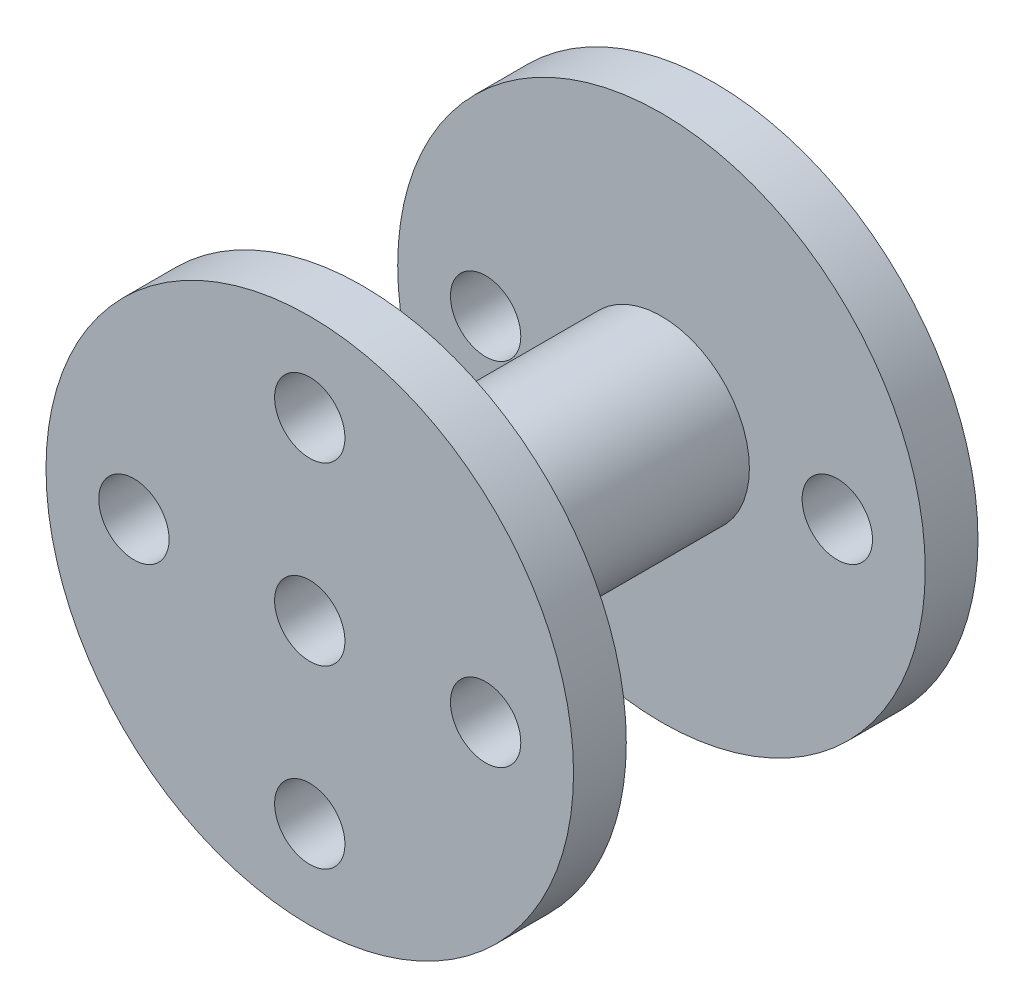
ISO-10303-21;
HEADER;
FILE_DESCRIPTION(('STEP AP214'),'2;1');
FILE_NAME('part.step','',(''),(''),'','','');
FILE_SCHEMA(('AUTOMOTIVE_DESIGN { 1 0 10303 214 1 1 1 1 }'));
ENDSEC;
DATA;
#1=APPLICATION_CONTEXT('core data for automotive mechanical design processes');
#2=APPLICATION_PROTOCOL_DEFINITION('international standard','automotive_design',2000,#1);
#3=PRODUCT_CONTEXT('',#1,'mechanical');
#4=PRODUCT('Part','Part','',(#3));
#5=PRODUCT_RELATED_PRODUCT_CATEGORY('part','',(#4));
#6=PRODUCT_DEFINITION_FORMATION('','',#4);
#7=PRODUCT_DEFINITION_CONTEXT('part definition',#1,'design');
#8=PRODUCT_DEFINITION('design','',#6,#7);
#9=PRODUCT_DEFINITION_SHAPE('','',#8);
#10=(LENGTH_UNIT() NAMED_UNIT(*) SI_UNIT(.MILLI.,.METRE.));
#11=(NAMED_UNIT(*) PLANE_ANGLE_UNIT() SI_UNIT($,.RADIAN.));
#12=(NAMED_UNIT(*) SI_UNIT($,.STERADIAN.) SOLID_ANGLE_UNIT());
#13=UNCERTAINTY_MEASURE_WITH_UNIT(LENGTH_MEASURE(1.E-05),#10,'distance_accuracy_value','');
#14=(GEOMETRIC_REPRESENTATION_CONTEXT(3) GLOBAL_UNCERTAINTY_ASSIGNED_CONTEXT((#13)) GLOBAL_UNIT_ASSIGNED_CONTEXT((#10,
#11,#12)) REPRESENTATION_CONTEXT('',''));
#15=CARTESIAN_POINT('',(0.,0.,0.));
#16=DIRECTION('',(0.,0.,1.));
#17=DIRECTION('',(1.,0.,0.));
#18=AXIS2_PLACEMENT_3D('',#15,#16,#17);
#19=CARTESIAN_POINT('',(0.,0.,3.));
#20=DIRECTION('',(0.,0.,1.));
#21=DIRECTION('',(1.,0.,0.));
#22=AXIS2_PLACEMENT_3D('',#19,#20,#21);
#23=PLANE('',#22);
#24=CARTESIAN_POINT('',(0.,0.,3.));
#25=DIRECTION('',(0.,0.,1.));
#26=DIRECTION('',(1.,0.,0.));
#27=AXIS2_PLACEMENT_3D('',#24,#25,#26);
#28=CIRCLE('',#27,5.);
#29=CARTESIAN_POINT('',(5.,0.,3.));
#30=VERTEX_POINT('',#29);
#31=EDGE_CURVE('E56',#30,#30,#28,.T.);
#32=ORIENTED_EDGE('',*,*,#31,.F.);
#33=EDGE_LOOP('',(#32));
#34=FACE_BOUND('',#33,.T.);
#35=CARTESIAN_POINT('',(10.,0.,3.));
#36=DIRECTION('',(0.,0.,1.));
#37=DIRECTION('',(1.,0.,0.));
#38=AXIS2_PLACEMENT_3D('',#35,#36,#37);
#39=CIRCLE('',#38,2.);
#40=CARTESIAN_POINT('',(12.,0.,3.));
#41=VERTEX_POINT('',#40);
#42=EDGE_CURVE('E42',#41,#41,#39,.T.);
#43=ORIENTED_EDGE('',*,*,#42,.F.);
#44=EDGE_LOOP('',(#43));
#45=FACE_BOUND('',#44,.T.);
#46=CARTESIAN_POINT('',(0.,0.,3.));
#47=DIRECTION('',(0.,0.,1.));
#48=DIRECTION('',(1.,0.,0.));
#49=AXIS2_PLACEMENT_3D('',#46,#47,#48);
#50=CIRCLE('',#49,15.);
#51=CARTESIAN_POINT('',(15.,0.,3.));
#52=VERTEX_POINT('',#51);
#53=EDGE_CURVE('E10',#52,#52,#50,.T.);
#54=ORIENTED_EDGE('',*,*,#53,.T.);
#55=EDGE_LOOP('',(#54));
#56=FACE_BOUND('',#55,.T.);
#57=CARTESIAN_POINT('',(-10.,0.,3.));
#58=DIRECTION('',(0.,0.,1.));
#59=DIRECTION('',(1.,0.,0.));
#60=AXIS2_PLACEMENT_3D('',#57,#58,#59);
#61=CIRCLE('',#60,2.);
#62=CARTESIAN_POINT('',(-8.,0.,3.));
#63=VERTEX_POINT('',#62);
#64=EDGE_CURVE('E47',#63,#63,#61,.T.);
#65=ORIENTED_EDGE('',*,*,#64,.F.);
#66=EDGE_LOOP('',(#65));
#67=FACE_BOUND('',#66,.T.);
#68=ADVANCED_FACE('F31',(#34,#45,#56,#67),#23,.T.);
#69=CARTESIAN_POINT('',(0.,0.,0.));
#70=DIRECTION('',(0.,0.,1.));
#71=DIRECTION('',(1.,0.,0.));
#72=AXIS2_PLACEMENT_3D('',#69,#70,#71);
#73=PLANE('',#72);
#74=CARTESIAN_POINT('',(0.,0.,0.));
#75=DIRECTION('',(0.,0.,1.));
#76=DIRECTION('',(1.,0.,0.));
#77=AXIS2_PLACEMENT_3D('',#74,#75,#76);
#78=CIRCLE('',#77,15.);
#79=CARTESIAN_POINT('',(15.,0.,0.));
#80=VERTEX_POINT('',#79);
#81=EDGE_CURVE('E35',#80,#80,#78,.T.);
#82=ORIENTED_EDGE('',*,*,#81,.F.);
#83=EDGE_LOOP('',(#82));
#84=FACE_BOUND('',#83,.T.);
#85=CARTESIAN_POINT('',(10.,0.,0.));
#86=DIRECTION('',(0.,0.,1.));
#87=DIRECTION('',(1.,0.,0.));
#88=AXIS2_PLACEMENT_3D('',#85,#86,#87);
#89=CIRCLE('',#88,2.);
#90=CARTESIAN_POINT('',(12.,0.,0.));
#91=VERTEX_POINT('',#90);
#92=EDGE_CURVE('E44',#91,#91,#89,.T.);
#93=ORIENTED_EDGE('',*,*,#92,.T.);
#94=EDGE_LOOP('',(#93));
#95=FACE_BOUND('',#94,.T.);
#96=CARTESIAN_POINT('',(-10.,0.,0.));
#97=DIRECTION('',(0.,0.,1.));
#98=DIRECTION('',(1.,0.,0.));
#99=AXIS2_PLACEMENT_3D('',#96,#97,#98);
#100=CIRCLE('',#99,2.);
#101=CARTESIAN_POINT('',(-8.,0.,0.));
#102=VERTEX_POINT('',#101);
#103=EDGE_CURVE('E50',#102,#102,#100,.T.);
#104=ORIENTED_EDGE('',*,*,#103,.T.);
#105=EDGE_LOOP('',(#104));
#106=FACE_BOUND('',#105,.T.);
#107=ADVANCED_FACE('F141',(#84,#95,#106),#73,.F.);
#108=CARTESIAN_POINT('',(0.,0.,3.));
#109=DIRECTION('',(0.,0.,-1.));
#110=DIRECTION('',(-1.,0.,0.));
#111=AXIS2_PLACEMENT_3D('',#108,#109,#110);
#112=CYLINDRICAL_SURFACE('',#111,15.);
#113=ORIENTED_EDGE('',*,*,#53,.F.);
#114=EDGE_LOOP('',(#113));
#115=FACE_BOUND('',#114,.T.);
#116=ORIENTED_EDGE('',*,*,#81,.T.);
#117=EDGE_LOOP('',(#116));
#118=FACE_BOUND('',#117,.T.);
#119=ADVANCED_FACE('F33',(#115,#118),#112,.T.);
#120=CARTESIAN_POINT('',(10.,0.,3.));
#121=DIRECTION('',(0.,0.,-1.));
#122=DIRECTION('',(-1.,0.,0.));
#123=AXIS2_PLACEMENT_3D('',#120,#121,#122);
#124=CYLINDRICAL_SURFACE('',#123,2.);
#125=ORIENTED_EDGE('',*,*,#42,.T.);
#126=EDGE_LOOP('',(#125));
#127=FACE_BOUND('',#126,.T.);
#128=ORIENTED_EDGE('',*,*,#92,.F.);
#129=EDGE_LOOP('',(#128));
#130=FACE_BOUND('',#129,.T.);
#131=ADVANCED_FACE('F151',(#127,#130),#124,.F.);
#132=CARTESIAN_POINT('',(-10.,0.,3.));
#133=DIRECTION('',(0.,0.,-1.));
#134=DIRECTION('',(-1.,0.,0.));
#135=AXIS2_PLACEMENT_3D('',#132,#133,#134);
#136=CYLINDRICAL_SURFACE('',#135,2.);
#137=ORIENTED_EDGE('',*,*,#64,.T.);
#138=EDGE_LOOP('',(#137));
#139=FACE_BOUND('',#138,.T.);
#140=ORIENTED_EDGE('',*,*,#103,.F.);
#141=EDGE_LOOP('',(#140));
#142=FACE_BOUND('',#141,.T.);
#143=ADVANCED_FACE('F154',(#139,#142),#136,.F.);
#144=CARTESIAN_POINT('',(0.,0.,20.));
#145=DIRECTION('',(0.,0.,-1.));
#146=DIRECTION('',(-1.,0.,0.));
#147=AXIS2_PLACEMENT_3D('',#144,#145,#146);
#148=CYLINDRICAL_SURFACE('',#147,5.);
#149=CARTESIAN_POINT('',(0.,0.,20.));
#150=DIRECTION('',(0.,0.,1.));
#151=DIRECTION('',(1.,0.,0.));
#152=AXIS2_PLACEMENT_3D('',#149,#150,#151);
#153=CIRCLE('',#152,5.);
#154=CARTESIAN_POINT('',(5.,0.,20.));
#155=VERTEX_POINT('',#154);
#156=EDGE_CURVE('E53',#155,#155,#153,.T.);
#157=ORIENTED_EDGE('',*,*,#156,.F.);
#158=EDGE_LOOP('',(#157));
#159=FACE_BOUND('',#158,.T.);
#160=ORIENTED_EDGE('',*,*,#31,.T.);
#161=EDGE_LOOP('',(#160));
#162=FACE_BOUND('',#161,.T.);
#163=ADVANCED_FACE('F111',(#159,#162),#148,.T.);
#164=CARTESIAN_POINT('',(0.,0.,23.));
#165=DIRECTION('',(0.,0.,1.));
#166=DIRECTION('',(1.,0.,0.));
#167=AXIS2_PLACEMENT_3D('',#164,#165,#166);
#168=PLANE('',#167);
#169=CARTESIAN_POINT('',(0.,0.,23.));
#170=DIRECTION('',(0.,0.,1.));
#171=DIRECTION('',(1.,0.,0.));
#172=AXIS2_PLACEMENT_3D('',#169,#170,#171);
#173=CIRCLE('',#172,2.);
#174=CARTESIAN_POINT('',(2.,0.,23.));
#175=VERTEX_POINT('',#174);
#176=EDGE_CURVE('E92',#175,#175,#173,.T.);
#177=ORIENTED_EDGE('',*,*,#176,.F.);
#178=EDGE_LOOP('',(#177));
#179=FACE_BOUND('',#178,.T.);
#180=CARTESIAN_POINT('',(10.,0.,23.));
#181=DIRECTION('',(0.,0.,1.));
#182=DIRECTION('',(1.,0.,0.));
#183=AXIS2_PLACEMENT_3D('',#180,#181,#182);
#184=CIRCLE('',#183,2.);
#185=CARTESIAN_POINT('',(12.,0.,23.));
#186=VERTEX_POINT('',#185);
#187=EDGE_CURVE('E77',#186,#186,#184,.T.);
#188=ORIENTED_EDGE('',*,*,#187,.F.);
#189=EDGE_LOOP('',(#188));
#190=FACE_BOUND('',#189,.T.);
#191=CARTESIAN_POINT('',(-10.,0.,23.));
#192=DIRECTION('',(0.,0.,1.));
#193=DIRECTION('',(1.,0.,0.));
#194=AXIS2_PLACEMENT_3D('',#191,#192,#193);
#195=CIRCLE('',#194,2.);
#196=CARTESIAN_POINT('',(-8.,0.,23.));
#197=VERTEX_POINT('',#196);
#198=EDGE_CURVE('E65',#197,#197,#195,.T.);
#199=ORIENTED_EDGE('',*,*,#198,.F.);
#200=EDGE_LOOP('',(#199));
#201=FACE_BOUND('',#200,.T.);
#202=CARTESIAN_POINT('',(0.,0.,23.));
#203=DIRECTION('',(0.,0.,1.));
#204=DIRECTION('',(1.,0.,0.));
#205=AXIS2_PLACEMENT_3D('',#202,#203,#204);
#206=CIRCLE('',#205,15.);
#207=CARTESIAN_POINT('',(15.,0.,23.));
#208=VERTEX_POINT('',#207);
#209=EDGE_CURVE('E59',#208,#208,#206,.T.);
#210=ORIENTED_EDGE('',*,*,#209,.T.);
#211=EDGE_LOOP('',(#210));
#212=FACE_BOUND('',#211,.T.);
#213=CARTESIAN_POINT('',(0.,10.,23.));
#214=DIRECTION('',(0.,0.,1.));
#215=DIRECTION('',(1.,0.,0.));
#216=AXIS2_PLACEMENT_3D('',#213,#214,#215);
#217=CIRCLE('',#216,2.);
#218=CARTESIAN_POINT('',(2.00000000000003,10.,23.));
#219=VERTEX_POINT('',#218);
#220=EDGE_CURVE('E71',#219,#219,#217,.T.);
#221=ORIENTED_EDGE('',*,*,#220,.F.);
#222=EDGE_LOOP('',(#221));
#223=FACE_BOUND('',#222,.T.);
#224=CARTESIAN_POINT('',(-1.05254516842123E-13,-10.,23.));
#225=DIRECTION('',(0.,0.,1.));
#226=DIRECTION('',(1.,0.,0.));
#227=AXIS2_PLACEMENT_3D('',#224,#225,#226);
#228=CIRCLE('',#227,2.);
#229=CARTESIAN_POINT('',(1.9999999999999,-10.,23.));
#230=VERTEX_POINT('',#229);
#231=EDGE_CURVE('E83',#230,#230,#228,.T.);
#232=ORIENTED_EDGE('',*,*,#231,.F.);
#233=EDGE_LOOP('',(#232));
#234=FACE_BOUND('',#233,.T.);
#235=ADVANCED_FACE('F107',(#179,#190,#201,#212,#223,#234),#168,.T.);
#236=CARTESIAN_POINT('',(0.,0.,20.));
#237=DIRECTION('',(0.,0.,1.));
#238=DIRECTION('',(1.,0.,0.));
#239=AXIS2_PLACEMENT_3D('',#236,#237,#238);
#240=PLANE('',#239);
#241=ORIENTED_EDGE('',*,*,#156,.T.);
#242=EDGE_LOOP('',(#241));
#243=FACE_BOUND('',#242,.T.);
#244=CARTESIAN_POINT('',(0.,0.,20.));
#245=DIRECTION('',(0.,0.,1.));
#246=DIRECTION('',(1.,0.,0.));
#247=AXIS2_PLACEMENT_3D('',#244,#245,#246);
#248=CIRCLE('',#247,15.);
#249=CARTESIAN_POINT('',(15.,0.,20.));
#250=VERTEX_POINT('',#249);
#251=EDGE_CURVE('E62',#250,#250,#248,.T.);
#252=ORIENTED_EDGE('',*,*,#251,.F.);
#253=EDGE_LOOP('',(#252));
#254=FACE_BOUND('',#253,.T.);
#255=CARTESIAN_POINT('',(-10.,0.,20.));
#256=DIRECTION('',(0.,0.,1.));
#257=DIRECTION('',(1.,0.,0.));
#258=AXIS2_PLACEMENT_3D('',#255,#256,#257);
#259=CIRCLE('',#258,2.);
#260=CARTESIAN_POINT('',(-8.,0.,20.));
#261=VERTEX_POINT('',#260);
#262=EDGE_CURVE('E68',#261,#261,#259,.T.);
#263=ORIENTED_EDGE('',*,*,#262,.T.);
#264=EDGE_LOOP('',(#263));
#265=FACE_BOUND('',#264,.T.);
#266=CARTESIAN_POINT('',(0.,10.,20.));
#267=DIRECTION('',(0.,0.,1.));
#268=DIRECTION('',(1.,0.,0.));
#269=AXIS2_PLACEMENT_3D('',#266,#267,#268);
#270=CIRCLE('',#269,2.);
#271=CARTESIAN_POINT('',(2.00000000000003,10.,20.));
#272=VERTEX_POINT('',#271);
#273=EDGE_CURVE('E74',#272,#272,#270,.T.);
#274=ORIENTED_EDGE('',*,*,#273,.T.);
#275=EDGE_LOOP('',(#274));
#276=FACE_BOUND('',#275,.T.);
#277=CARTESIAN_POINT('',(10.,0.,20.));
#278=DIRECTION('',(0.,0.,1.));
#279=DIRECTION('',(1.,0.,0.));
#280=AXIS2_PLACEMENT_3D('',#277,#278,#279);
#281=CIRCLE('',#280,2.);
#282=CARTESIAN_POINT('',(12.,0.,20.));
#283=VERTEX_POINT('',#282);
#284=EDGE_CURVE('E80',#283,#283,#281,.T.);
#285=ORIENTED_EDGE('',*,*,#284,.T.);
#286=EDGE_LOOP('',(#285));
#287=FACE_BOUND('',#286,.T.);
#288=CARTESIAN_POINT('',(-1.05254516842123E-13,-10.,20.));
#289=DIRECTION('',(0.,0.,1.));
#290=DIRECTION('',(1.,0.,0.));
#291=AXIS2_PLACEMENT_3D('',#288,#289,#290);
#292=CIRCLE('',#291,2.);
#293=CARTESIAN_POINT('',(1.9999999999999,-10.,20.));
#294=VERTEX_POINT('',#293);
#295=EDGE_CURVE('E86',#294,#294,#292,.T.);
#296=ORIENTED_EDGE('',*,*,#295,.T.);
#297=EDGE_LOOP('',(#296));
#298=FACE_BOUND('',#297,.T.);
#299=ADVANCED_FACE('F110',(#243,#254,#265,#276,#287,#298),#240,.F.);
#300=CARTESIAN_POINT('',(0.,0.,23.));
#301=DIRECTION('',(0.,0.,-1.));
#302=DIRECTION('',(-1.,0.,0.));
#303=AXIS2_PLACEMENT_3D('',#300,#301,#302);
#304=CYLINDRICAL_SURFACE('',#303,15.);
#305=ORIENTED_EDGE('',*,*,#209,.F.);
#306=EDGE_LOOP('',(#305));
#307=FACE_BOUND('',#306,.T.);
#308=ORIENTED_EDGE('',*,*,#251,.T.);
#309=EDGE_LOOP('',(#308));
#310=FACE_BOUND('',#309,.T.);
#311=ADVANCED_FACE('F130',(#307,#310),#304,.T.);
#312=CARTESIAN_POINT('',(-10.,0.,23.));
#313=DIRECTION('',(0.,0.,-1.));
#314=DIRECTION('',(-1.,0.,0.));
#315=AXIS2_PLACEMENT_3D('',#312,#313,#314);
#316=CYLINDRICAL_SURFACE('',#315,2.);
#317=ORIENTED_EDGE('',*,*,#198,.T.);
#318=EDGE_LOOP('',(#317));
#319=FACE_BOUND('',#318,.T.);
#320=ORIENTED_EDGE('',*,*,#262,.F.);
#321=EDGE_LOOP('',(#320));
#322=FACE_BOUND('',#321,.T.);
#323=ADVANCED_FACE('F136',(#319,#322),#316,.F.);
#324=CARTESIAN_POINT('',(0.,10.,23.));
#325=DIRECTION('',(0.,0.,-1.));
#326=DIRECTION('',(-1.,0.,0.));
#327=AXIS2_PLACEMENT_3D('',#324,#325,#326);
#328=CYLINDRICAL_SURFACE('',#327,2.);
#329=ORIENTED_EDGE('',*,*,#220,.T.);
#330=EDGE_LOOP('',(#329));
#331=FACE_BOUND('',#330,.T.);
#332=ORIENTED_EDGE('',*,*,#273,.F.);
#333=EDGE_LOOP('',(#332));
#334=FACE_BOUND('',#333,.T.);
#335=ADVANCED_FACE('F197',(#331,#334),#328,.F.);
#336=CARTESIAN_POINT('',(10.,0.,23.));
#337=DIRECTION('',(0.,0.,-1.));
#338=DIRECTION('',(-1.,0.,0.));
#339=AXIS2_PLACEMENT_3D('',#336,#337,#338);
#340=CYLINDRICAL_SURFACE('',#339,2.);
#341=ORIENTED_EDGE('',*,*,#187,.T.);
#342=EDGE_LOOP('',(#341));
#343=FACE_BOUND('',#342,.T.);
#344=ORIENTED_EDGE('',*,*,#284,.F.);
#345=EDGE_LOOP('',(#344));
#346=FACE_BOUND('',#345,.T.);
#347=ADVANCED_FACE('F125',(#343,#346),#340,.F.);
#348=CARTESIAN_POINT('',(-1.05254516842123E-13,-10.,23.));
#349=DIRECTION('',(0.,0.,-1.));
#350=DIRECTION('',(-1.,0.,0.));
#351=AXIS2_PLACEMENT_3D('',#348,#349,#350);
#352=CYLINDRICAL_SURFACE('',#351,2.);
#353=ORIENTED_EDGE('',*,*,#231,.T.);
#354=EDGE_LOOP('',(#353));
#355=FACE_BOUND('',#354,.T.);
#356=ORIENTED_EDGE('',*,*,#295,.F.);
#357=EDGE_LOOP('',(#356));
#358=FACE_BOUND('',#357,.T.);
#359=ADVANCED_FACE('F103',(#355,#358),#352,.F.);
#360=CARTESIAN_POINT('',(0.,0.,8.));
#361=DIRECTION('',(0.,0.,1.));
#362=DIRECTION('',(1.,0.,0.));
#363=AXIS2_PLACEMENT_3D('',#360,#361,#362);
#364=CYLINDRICAL_SURFACE('',#363,2.);
#365=CARTESIAN_POINT('',(0.,0.,8.));
#366=DIRECTION('',(0.,0.,1.));
#367=DIRECTION('',(1.,0.,0.));
#368=AXIS2_PLACEMENT_3D('',#365,#366,#367);
#369=CIRCLE('',#368,2.);
#370=CARTESIAN_POINT('',(2.,0.,8.));
#371=VERTEX_POINT('',#370);
#372=EDGE_CURVE('E89',#371,#371,#369,.T.);
#373=ORIENTED_EDGE('',*,*,#372,.F.);
#374=EDGE_LOOP('',(#373));
#375=FACE_BOUND('',#374,.T.);
#376=ORIENTED_EDGE('',*,*,#176,.T.);
#377=EDGE_LOOP('',(#376));
#378=FACE_BOUND('',#377,.T.);
#379=ADVANCED_FACE('F100',(#375,#378),#364,.F.);
#380=CARTESIAN_POINT('',(0.,0.,8.));
#381=DIRECTION('',(0.,0.,1.));
#382=DIRECTION('',(1.,0.,0.));
#383=AXIS2_PLACEMENT_3D('',#380,#381,#382);
#384=PLANE('',#383);
#385=ORIENTED_EDGE('',*,*,#372,.T.);
#386=EDGE_LOOP('',(#385));
#387=FACE_BOUND('',#386,.T.);
#388=ADVANCED_FACE('F98',(#387),#384,.T.);
#389=CLOSED_SHELL('',(#68,#107,#119,#131,#143,#163,#235,#299,#311,#323,#335,#347,#359,#379,#388));
#390=MANIFOLD_SOLID_BREP('B2',#389);
#391=ADVANCED_BREP_SHAPE_REPRESENTATION('',(#18,#390),#14);
#392=SHAPE_DEFINITION_REPRESENTATION(#9,#391);
ENDSEC;
END-ISO-10303-21;
